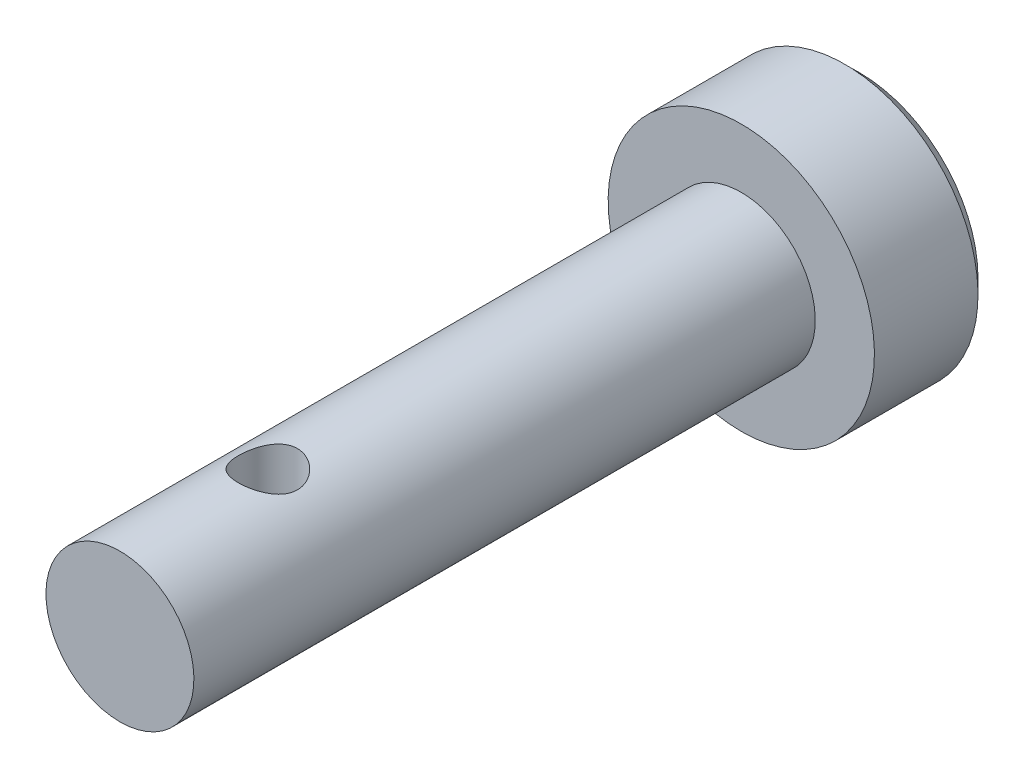
ISO-10303-21;
HEADER;
FILE_DESCRIPTION(('STEP AP214'),'2;1');
FILE_NAME('part.step','',(''),(''),'','','');
FILE_SCHEMA(('AUTOMOTIVE_DESIGN { 1 0 10303 214 1 1 1 1 }'));
ENDSEC;
DATA;
#1=APPLICATION_CONTEXT('core data for automotive mechanical design processes');
#2=APPLICATION_PROTOCOL_DEFINITION('international standard','automotive_design',2000,#1);
#3=PRODUCT_CONTEXT('',#1,'mechanical');
#4=PRODUCT('Part','Part','',(#3));
#5=PRODUCT_RELATED_PRODUCT_CATEGORY('part','',(#4));
#6=PRODUCT_DEFINITION_FORMATION('','',#4);
#7=PRODUCT_DEFINITION_CONTEXT('part definition',#1,'design');
#8=PRODUCT_DEFINITION('design','',#6,#7);
#9=PRODUCT_DEFINITION_SHAPE('','',#8);
#10=(LENGTH_UNIT() NAMED_UNIT(*) SI_UNIT(.MILLI.,.METRE.));
#11=(NAMED_UNIT(*) PLANE_ANGLE_UNIT() SI_UNIT($,.RADIAN.));
#12=(NAMED_UNIT(*) SI_UNIT($,.STERADIAN.) SOLID_ANGLE_UNIT());
#13=UNCERTAINTY_MEASURE_WITH_UNIT(LENGTH_MEASURE(1.E-05),#10,'distance_accuracy_value','');
#14=(GEOMETRIC_REPRESENTATION_CONTEXT(3) GLOBAL_UNCERTAINTY_ASSIGNED_CONTEXT((#13)) GLOBAL_UNIT_ASSIGNED_CONTEXT((#10,
#11,#12)) REPRESENTATION_CONTEXT('',''));
#15=CARTESIAN_POINT('',(0.,0.,0.));
#16=DIRECTION('',(0.,0.,1.));
#17=DIRECTION('',(1.,0.,0.));
#18=AXIS2_PLACEMENT_3D('',#15,#16,#17);
#19=CARTESIAN_POINT('',(0.,0.,0.));
#20=DIRECTION('',(0.,0.,1.));
#21=DIRECTION('',(0.,-1.,0.));
#22=AXIS2_PLACEMENT_3D('',#19,#20,#21);
#23=PLANE('',#22);
#24=CARTESIAN_POINT('',(0.,0.,0.));
#25=DIRECTION('',(0.,0.,1.));
#26=DIRECTION('',(0.,-1.,0.));
#27=AXIS2_PLACEMENT_3D('',#24,#25,#26);
#28=CIRCLE('',#27,8.);
#29=CARTESIAN_POINT('',(0.,-8.,0.));
#30=VERTEX_POINT('',#29);
#31=EDGE_CURVE('E10',#30,#30,#28,.F.);
#32=ORIENTED_EDGE('',*,*,#31,.T.);
#33=EDGE_LOOP('',(#32));
#34=FACE_BOUND('',#33,.T.);
#35=ADVANCED_FACE('F39',(#34),#23,.F.);
#36=CARTESIAN_POINT('',(0.,0.,50.));
#37=DIRECTION('',(0.,0.,1.));
#38=DIRECTION('',(0.,-1.,0.));
#39=AXIS2_PLACEMENT_3D('',#36,#37,#38);
#40=CYLINDRICAL_SURFACE('',#39,9.);
#41=CARTESIAN_POINT('',(0.,0.,1.));
#42=DIRECTION('',(0.,0.,1.));
#43=DIRECTION('',(0.,-1.,0.));
#44=AXIS2_PLACEMENT_3D('',#41,#42,#43);
#45=CIRCLE('',#44,9.);
#46=CARTESIAN_POINT('',(0.,-9.,1.));
#47=VERTEX_POINT('',#46);
#48=EDGE_CURVE('E48',#47,#47,#45,.T.);
#49=ORIENTED_EDGE('',*,*,#48,.T.);
#50=EDGE_LOOP('',(#49));
#51=FACE_BOUND('',#50,.T.);
#52=CARTESIAN_POINT('',(0.,0.,8.));
#53=DIRECTION('',(0.,0.,1.));
#54=DIRECTION('',(0.,-1.,0.));
#55=AXIS2_PLACEMENT_3D('',#52,#53,#54);
#56=CIRCLE('',#55,9.);
#57=CARTESIAN_POINT('',(0.,-9.,8.));
#58=VERTEX_POINT('',#57);
#59=EDGE_CURVE('E58',#58,#58,#56,.T.);
#60=ORIENTED_EDGE('',*,*,#59,.F.);
#61=EDGE_LOOP('',(#60));
#62=FACE_BOUND('',#61,.T.);
#63=ADVANCED_FACE('F90',(#51,#62),#40,.T.);
#64=CARTESIAN_POINT('',(0.,9.,8.));
#65=DIRECTION('',(0.,0.,-1.));
#66=DIRECTION('',(0.,1.,0.));
#67=AXIS2_PLACEMENT_3D('',#64,#65,#66);
#68=PLANE('',#67);
#69=CARTESIAN_POINT('',(0.,0.,8.));
#70=DIRECTION('',(0.,0.,1.));
#71=DIRECTION('',(0.,-1.,0.));
#72=AXIS2_PLACEMENT_3D('',#69,#70,#71);
#73=CIRCLE('',#72,5.);
#74=CARTESIAN_POINT('',(0.,-5.,8.));
#75=VERTEX_POINT('',#74);
#76=EDGE_CURVE('E102',#75,#75,#73,.T.);
#77=ORIENTED_EDGE('',*,*,#76,.F.);
#78=EDGE_LOOP('',(#77));
#79=FACE_BOUND('',#78,.T.);
#80=ORIENTED_EDGE('',*,*,#59,.T.);
#81=EDGE_LOOP('',(#80));
#82=FACE_BOUND('',#81,.T.);
#83=ADVANCED_FACE('F86',(#79,#82),#68,.F.);
#84=CARTESIAN_POINT('',(0.,0.,50.));
#85=DIRECTION('',(0.,0.,1.));
#86=DIRECTION('',(0.,-1.,0.));
#87=AXIS2_PLACEMENT_3D('',#84,#85,#86);
#88=CYLINDRICAL_SURFACE('',#87,5.);
#89=CARTESIAN_POINT('',(0.,5.,42.));
#90=CARTESIAN_POINT('',(-0.107493005442891,4.99999271227085,41.9999901481763));
#91=CARTESIAN_POINT('',(-0.215172564090672,4.99649294306932,41.9912822479116));
#92=CARTESIAN_POINT('',(-0.427496480417894,4.98283453100641,41.9567522964788));
#93=CARTESIAN_POINT('',(-0.532131777561246,4.97265778698877,41.9308837209139));
#94=CARTESIAN_POINT('',(-0.734953922727401,4.94674209213118,41.8631239219412));
#95=CARTESIAN_POINT('',(-0.833160661616958,4.93102136364072,41.8212851537833));
#96=CARTESIAN_POINT('',(-1.02107197032837,4.89556610796078,41.7229808266734));
#97=CARTESIAN_POINT('',(-1.11077947675099,4.87583297458057,41.6665203450811));
#98=CARTESIAN_POINT('',(-1.28350100757039,4.83330886170419,41.5377645014391));
#99=CARTESIAN_POINT('',(-1.36606227255021,4.8104229692919,41.4648933437597));
#100=CARTESIAN_POINT('',(-1.51817500478472,4.76460576906194,41.3065999965232));
#101=CARTESIAN_POINT('',(-1.58772010713353,4.74167444453792,41.2211717027883));
#102=CARTESIAN_POINT('',(-1.71487456729287,4.69722791797136,41.0355719297577));
#103=CARTESIAN_POINT('',(-1.77181498119547,4.67582115964951,40.9349135139768));
#104=CARTESIAN_POINT('',(-1.86775471903714,4.63833647186792,40.7244636015799));
#105=CARTESIAN_POINT('',(-1.90676256428583,4.62225601244176,40.6146764721516));
#106=CARTESIAN_POINT('',(-1.96389882339586,4.59826357660818,40.3942876664079));
#107=CARTESIAN_POINT('',(-1.98289396580564,4.59001420355605,40.2839487644238));
#108=CARTESIAN_POINT('',(-2.00217296164002,4.58164004049144,40.0613650016927));
#109=CARTESIAN_POINT('',(-2.00246601631321,4.58151125522768,39.949121105375));
#110=CARTESIAN_POINT('',(-1.98498936750454,4.58910500279994,39.734243328542));
#111=CARTESIAN_POINT('',(-1.96847531430513,4.5962817503845,39.631484285591));
#112=CARTESIAN_POINT('',(-1.91994688029781,4.61676187607836,39.4303404439933));
#113=CARTESIAN_POINT('',(-1.88792979480462,4.63006632321673,39.3319564118897));
#114=CARTESIAN_POINT('',(-1.80869473255106,4.6615948508853,39.139982163804));
#115=CARTESIAN_POINT('',(-1.76117986231531,4.67991379280788,39.0465307609453));
#116=CARTESIAN_POINT('',(-1.6525064607322,4.7193811638989,38.8685841836384));
#117=CARTESIAN_POINT('',(-1.59134280510084,4.74053065456848,38.7840923905972));
#118=CARTESIAN_POINT('',(-1.45155059945443,4.78526736742271,38.619590271198));
#119=CARTESIAN_POINT('',(-1.37193746297063,4.80891664976151,38.540431270554));
#120=CARTESIAN_POINT('',(-1.20031442743019,4.85459824958282,38.396315521998));
#121=CARTESIAN_POINT('',(-1.10830206533443,4.87663024445325,38.3313616025897));
#122=CARTESIAN_POINT('',(-0.912077652605836,4.91714681264548,38.2163825525842));
#123=CARTESIAN_POINT('',(-0.80766049134647,4.93555270095415,38.166677718803));
#124=CARTESIAN_POINT('',(-0.591023765482874,4.96614828328759,38.085832138922));
#125=CARTESIAN_POINT('',(-0.478808196849666,4.97834113462382,38.0546819624426));
#126=CARTESIAN_POINT('',(-0.256895887607813,4.9945613950691,38.0135517045803));
#127=CARTESIAN_POINT('',(-0.147443293985528,4.99902945833514,38.0024275457464));
#128=CARTESIAN_POINT('',(0.0718453098078221,5.00068478510631,37.9982868994714));
#129=CARTESIAN_POINT('',(0.181681213223928,4.99787393582291,38.0052657184525));
#130=CARTESIAN_POINT('',(0.393432739121991,4.98557567063753,38.036291752552));
#131=CARTESIAN_POINT('',(0.495482491775479,4.97639391345523,38.059557980351));
#132=CARTESIAN_POINT('',(0.694135428060783,4.952594414055,38.1214357083098));
#133=CARTESIAN_POINT('',(0.790737910224846,4.9379759735653,38.1600491796687));
#134=CARTESIAN_POINT('',(0.979078785816701,4.90416594770811,38.25278493968));
#135=CARTESIAN_POINT('',(1.0705780227554,4.88484815979803,38.3073454720432));
#136=CARTESIAN_POINT('',(1.24344359124655,4.84373364745525,38.4299403239057));
#137=CARTESIAN_POINT('',(1.32480584076112,4.8219359311027,38.4979800429226));
#138=CARTESIAN_POINT('',(1.48072304302882,4.77645117638112,38.6508700129496));
#139=CARTESIAN_POINT('',(1.55447393380606,4.75273441425052,38.7365335415062));
#140=CARTESIAN_POINT('',(1.68675119741371,4.70741672917132,38.9194400830094));
#141=CARTESIAN_POINT('',(1.74527506133751,4.68581615526511,39.01668500034));
#142=CARTESIAN_POINT('',(1.84580750193162,4.64714299907708,39.2214616945941));
#143=CARTESIAN_POINT('',(1.88765059453445,4.63011630884788,39.3290839992123));
#144=CARTESIAN_POINT('',(1.9522962197053,4.60323673477931,39.5507336517152));
#145=CARTESIAN_POINT('',(1.97511280526931,4.59337855695998,39.6647562058124));
#146=CARTESIAN_POINT('',(1.99971561727839,4.58271759299926,39.8871279017746));
#147=CARTESIAN_POINT('',(2.00289708230286,4.58131421008172,39.9952948395934));
#148=CARTESIAN_POINT('',(1.99180315927752,4.58614836033098,40.2105448577133));
#149=CARTESIAN_POINT('',(1.97752998791377,4.59238492324794,40.3176280739026));
#150=CARTESIAN_POINT('',(1.93307136615364,4.61126649079021,40.523332189855));
#151=CARTESIAN_POINT('',(1.90353749357097,4.6236483182745,40.622120274433));
#152=CARTESIAN_POINT('',(1.830005448491,4.65324001232697,40.8133786296135));
#153=CARTESIAN_POINT('',(1.7860032813938,4.67045121206007,40.9058471468998));
#154=CARTESIAN_POINT('',(1.68187276275972,4.70898609604492,41.0876096192708));
#155=CARTESIAN_POINT('',(1.62096533515948,4.73048882313242,41.1764186701305));
#156=CARTESIAN_POINT('',(1.48589211927148,4.77463804372237,41.3429933172038));
#157=CARTESIAN_POINT('',(1.41172233481811,4.79728488048407,41.4207555721283));
#158=CARTESIAN_POINT('',(1.24650550627245,4.84293567087394,41.5682028532636));
#159=CARTESIAN_POINT('',(1.15467600114613,4.86586757962185,41.6370373068981));
#160=CARTESIAN_POINT('',(0.959900320285769,4.90800406713717,41.7583370426216));
#161=CARTESIAN_POINT('',(0.856949004547229,4.92720691092906,41.8107947121525));
#162=CARTESIAN_POINT('',(0.644738062495197,4.95939714815861,41.8966222151903));
#163=CARTESIAN_POINT('',(0.535631618219691,4.97249363055028,41.9303293235603));
#164=CARTESIAN_POINT('',(0.312876546281216,4.99144306209365,41.9786391209543));
#165=CARTESIAN_POINT('',(0.199243525858906,4.99731899495637,41.9933024367439));
#166=CARTESIAN_POINT('',(0.056912297890925,4.99975899504136,41.9993953809783));
#167=CARTESIAN_POINT('',(0.0284626887407561,5.00000192969176,42.0000026086292));
#168=CARTESIAN_POINT('',(0.,5.,42.));
#169=B_SPLINE_CURVE_WITH_KNOTS('',3,(#89,#90,#91,#92,#93,#94,#95,#96,#97,#98,#99,#100,#101,#102,
#103,#104,#105,#106,#107,#108,#109,#110,#111,#112,#113,#114,#115,#116,#117,#118,#119,#120,#121,
#122,#123,#124,#125,#126,#127,#128,#129,#130,#131,#132,#133,#134,#135,#136,#137,#138,#139,#140,
#141,#142,#143,#144,#145,#146,#147,#148,#149,#150,#151,#152,#153,#154,#155,#156,#157,#158,#159,
#160,#161,#162,#163,#164,#165,#166,#167,#168),.UNSPECIFIED.,.T.,.F.,(4,2,2,2,2,2,2,2,2,2,2,2,2,
2,2,2,2,2,2,2,2,2,2,2,2,2,2,2,2,2,2,2,2,2,2,2,2,2,2,4),(0.,0.32240298789307,0.645683636007934,
0.967911457471581,1.29002753567984,1.62597381700396,1.96208394934411,2.31315258819217,
2.66405423118267,2.99904105308827,3.33386306340487,3.64538328401371,3.95695787256046,
4.27489126298815,4.59294421938181,4.93558349186555,5.27829092839731,5.62776913162804,
5.97706956113788,6.30569184528005,6.6342289357008,6.94800455564363,7.26182048993794,
7.58523513398259,7.90877959498966,8.2536847462441,8.59864669043745,8.94695045140825,
9.2949967264593,9.61799673392745,9.94095572563042,10.2511431854877,10.5614163580516,
10.8894546805669,11.2175920134839,11.5670042353383,11.9165786364053,12.2596430101331,
12.6016125240434,12.6869804589679),.UNSPECIFIED.);
#170=CARTESIAN_POINT('',(0.,5.,42.));
#171=VERTEX_POINT('',#170);
#172=EDGE_CURVE('E53',#171,#171,#169,.T.);
#173=ORIENTED_EDGE('',*,*,#172,.T.);
#174=EDGE_LOOP('',(#173));
#175=FACE_BOUND('',#174,.T.);
#176=CARTESIAN_POINT('',(0.,-5.,38.));
#177=CARTESIAN_POINT('',(-0.107493005442891,-4.99999271227084,38.0000098518237));
#178=CARTESIAN_POINT('',(-0.215172564090673,-4.99649294306932,38.0087177520884));
#179=CARTESIAN_POINT('',(-0.427496480417895,-4.98283453100641,38.0432477035212));
#180=CARTESIAN_POINT('',(-0.532131777561246,-4.97265778698877,38.0691162790861));
#181=CARTESIAN_POINT('',(-0.7349539227274,-4.94674209213118,38.1368760780588));
#182=CARTESIAN_POINT('',(-0.833160661616955,-4.93102136364072,38.1787148462167));
#183=CARTESIAN_POINT('',(-1.02107197032836,-4.89556610796078,38.2770191733266));
#184=CARTESIAN_POINT('',(-1.11077947675099,-4.87583297458057,38.3334796549189));
#185=CARTESIAN_POINT('',(-1.28350100757039,-4.83330886170419,38.4622354985609));
#186=CARTESIAN_POINT('',(-1.36606227255021,-4.8104229692919,38.5351066562403));
#187=CARTESIAN_POINT('',(-1.51817500478472,-4.76460576906194,38.6934000034768));
#188=CARTESIAN_POINT('',(-1.58772010713353,-4.74167444453792,38.7788282972118));
#189=CARTESIAN_POINT('',(-1.71487456729287,-4.69722791797136,38.9644280702423));
#190=CARTESIAN_POINT('',(-1.77181498119547,-4.67582115964951,39.0650864860232));
#191=CARTESIAN_POINT('',(-1.86775471903714,-4.63833647186792,39.2755363984201));
#192=CARTESIAN_POINT('',(-1.90676256428583,-4.62225601244176,39.3853235278484));
#193=CARTESIAN_POINT('',(-1.96389882339586,-4.59826357660818,39.6057123335921));
#194=CARTESIAN_POINT('',(-1.98289396580564,-4.59001420355605,39.7160512355762));
#195=CARTESIAN_POINT('',(-2.00217296164002,-4.58164004049144,39.9386349983073));
#196=CARTESIAN_POINT('',(-2.00246601631321,-4.58151125522768,40.050878894625));
#197=CARTESIAN_POINT('',(-1.98498936750454,-4.58910500279994,40.265756671458));
#198=CARTESIAN_POINT('',(-1.96847531430513,-4.5962817503845,40.368515714409));
#199=CARTESIAN_POINT('',(-1.91994688029781,-4.61676187607836,40.5696595560067));
#200=CARTESIAN_POINT('',(-1.88792979480462,-4.63006632321673,40.6680435881103));
#201=CARTESIAN_POINT('',(-1.80869473255106,-4.6615948508853,40.860017836196));
#202=CARTESIAN_POINT('',(-1.76117986231531,-4.67991379280788,40.9534692390547));
#203=CARTESIAN_POINT('',(-1.6525064607322,-4.7193811638989,41.1314158163616));
#204=CARTESIAN_POINT('',(-1.59134280510084,-4.74053065456848,41.2159076094028));
#205=CARTESIAN_POINT('',(-1.45155059945443,-4.78526736742271,41.380409728802));
#206=CARTESIAN_POINT('',(-1.37193746297063,-4.80891664976151,41.459568729446));
#207=CARTESIAN_POINT('',(-1.20031442743019,-4.85459824958282,41.603684478002));
#208=CARTESIAN_POINT('',(-1.10830206533443,-4.87663024445325,41.6686383974103));
#209=CARTESIAN_POINT('',(-0.912077652605836,-4.91714681264548,41.7836174474158));
#210=CARTESIAN_POINT('',(-0.80766049134647,-4.93555270095415,41.833322281197));
#211=CARTESIAN_POINT('',(-0.591023765482874,-4.96614828328759,41.914167861078));
#212=CARTESIAN_POINT('',(-0.478808196849666,-4.97834113462382,41.9453180375574));
#213=CARTESIAN_POINT('',(-0.256895887607813,-4.9945613950691,41.9864482954197));
#214=CARTESIAN_POINT('',(-0.147443293985528,-4.99902945833514,41.9975724542536));
#215=CARTESIAN_POINT('',(0.0718453098078221,-5.00068478510631,42.0017131005286));
#216=CARTESIAN_POINT('',(0.181681213223928,-4.99787393582291,41.9947342815475));
#217=CARTESIAN_POINT('',(0.393432739121991,-4.98557567063753,41.963708247448));
#218=CARTESIAN_POINT('',(0.495482491775479,-4.97639391345523,41.940442019649));
#219=CARTESIAN_POINT('',(0.694135428060783,-4.952594414055,41.8785642916902));
#220=CARTESIAN_POINT('',(0.790737910224846,-4.9379759735653,41.8399508203313));
#221=CARTESIAN_POINT('',(0.979078785816702,-4.90416594770811,41.74721506032));
#222=CARTESIAN_POINT('',(1.07057802275541,-4.88484815979803,41.6926545279568));
#223=CARTESIAN_POINT('',(1.24344359124655,-4.84373364745524,41.5700596760943));
#224=CARTESIAN_POINT('',(1.32480584076112,-4.8219359311027,41.5020199570774));
#225=CARTESIAN_POINT('',(1.48072304302882,-4.77645117638112,41.3491299870504));
#226=CARTESIAN_POINT('',(1.55447393380606,-4.75273441425052,41.2634664584938));
#227=CARTESIAN_POINT('',(1.68675119741371,-4.70741672917132,41.0805599169906));
#228=CARTESIAN_POINT('',(1.74527506133751,-4.68581615526511,40.98331499966));
#229=CARTESIAN_POINT('',(1.84580750193162,-4.64714299907708,40.7785383054059));
#230=CARTESIAN_POINT('',(1.88765059453445,-4.63011630884788,40.6709160007877));
#231=CARTESIAN_POINT('',(1.9522962197053,-4.60323673477931,40.4492663482848));
#232=CARTESIAN_POINT('',(1.97511280526931,-4.59337855695998,40.3352437941876));
#233=CARTESIAN_POINT('',(1.99971561727839,-4.58271759299926,40.1128720982255));
#234=CARTESIAN_POINT('',(2.00289708230286,-4.58131421008172,40.0047051604066));
#235=CARTESIAN_POINT('',(1.99180315927752,-4.58614836033098,39.7894551422867));
#236=CARTESIAN_POINT('',(1.97752998791377,-4.59238492324794,39.6823719260974));
#237=CARTESIAN_POINT('',(1.93307136615364,-4.61126649079021,39.476667810145));
#238=CARTESIAN_POINT('',(1.90353749357097,-4.6236483182745,39.377879725567));
#239=CARTESIAN_POINT('',(1.830005448491,-4.65324001232697,39.1866213703865));
#240=CARTESIAN_POINT('',(1.7860032813938,-4.67045121206007,39.0941528531002));
#241=CARTESIAN_POINT('',(1.68187276275972,-4.70898609604492,38.9123903807292));
#242=CARTESIAN_POINT('',(1.62096533515948,-4.73048882313242,38.8235813298695));
#243=CARTESIAN_POINT('',(1.48589211927148,-4.77463804372237,38.6570066827962));
#244=CARTESIAN_POINT('',(1.41172233481811,-4.79728488048407,38.5792444278717));
#245=CARTESIAN_POINT('',(1.24650550627245,-4.84293567087394,38.4317971467364));
#246=CARTESIAN_POINT('',(1.15467600114613,-4.86586757962185,38.3629626931019));
#247=CARTESIAN_POINT('',(0.959900320285769,-4.90800406713717,38.2416629573784));
#248=CARTESIAN_POINT('',(0.856949004547229,-4.92720691092906,38.1892052878475));
#249=CARTESIAN_POINT('',(0.644738062495197,-4.95939714815861,38.1033777848097));
#250=CARTESIAN_POINT('',(0.535631618219691,-4.97249363055028,38.0696706764397));
#251=CARTESIAN_POINT('',(0.312876546281215,-4.99144306209365,38.0213608790457));
#252=CARTESIAN_POINT('',(0.199243525858906,-4.99731899495637,38.0066975632561));
#253=CARTESIAN_POINT('',(0.056912297890925,-4.99975899504136,38.0006046190217));
#254=CARTESIAN_POINT('',(0.0284626887407561,-5.00000192969175,37.9999973913708));
#255=CARTESIAN_POINT('',(0.,-5.,38.));
#256=B_SPLINE_CURVE_WITH_KNOTS('',3,(#176,#177,#178,#179,#180,#181,#182,#183,#184,#185,#186,
#187,#188,#189,#190,#191,#192,#193,#194,#195,#196,#197,#198,#199,#200,#201,#202,#203,#204,#205,
#206,#207,#208,#209,#210,#211,#212,#213,#214,#215,#216,#217,#218,#219,#220,#221,#222,#223,#224,
#225,#226,#227,#228,#229,#230,#231,#232,#233,#234,#235,#236,#237,#238,#239,#240,#241,#242,#243,
#244,#245,#246,#247,#248,#249,#250,#251,#252,#253,#254,#255),.UNSPECIFIED.,.T.,.F.,(4,2,2,2,2,2,
2,2,2,2,2,2,2,2,2,2,2,2,2,2,2,2,2,2,2,2,2,2,2,2,2,2,2,2,2,2,2,2,2,4),(0.,0.32240298789307,
0.645683636007934,0.967911457471578,1.29002753567984,1.62597381700396,1.96208394934411,
2.31315258819217,2.66405423118267,2.99904105308827,3.33386306340487,3.64538328401371,
3.95695787256046,4.27489126298815,4.59294421938181,4.93558349186555,5.27829092839731,
5.62776913162804,5.97706956113788,6.30569184528005,6.6342289357008,6.94800455564363,
7.26182048993794,7.5852351339826,7.90877959498966,8.2536847462441,8.59864669043745,
8.94695045140825,9.2949967264593,9.61799673392745,9.94095572563043,10.2511431854877,
10.5614163580516,10.8894546805669,11.2175920134839,11.5670042353383,11.9165786364053,
12.2596430101331,12.6016125240434,12.6869804589679),.UNSPECIFIED.);
#257=CARTESIAN_POINT('',(0.,-5.,38.));
#258=VERTEX_POINT('',#257);
#259=EDGE_CURVE('E66',#258,#258,#256,.T.);
#260=ORIENTED_EDGE('',*,*,#259,.T.);
#261=EDGE_LOOP('',(#260));
#262=FACE_BOUND('',#261,.T.);
#263=CARTESIAN_POINT('',(0.,0.,50.));
#264=DIRECTION('',(0.,0.,1.));
#265=DIRECTION('',(0.,-1.,0.));
#266=AXIS2_PLACEMENT_3D('',#263,#264,#265);
#267=CIRCLE('',#266,4.99999999999999);
#268=CARTESIAN_POINT('',(0.,-4.99999999999999,50.));
#269=VERTEX_POINT('',#268);
#270=EDGE_CURVE('E108',#269,#269,#267,.T.);
#271=ORIENTED_EDGE('',*,*,#270,.F.);
#272=EDGE_LOOP('',(#271));
#273=FACE_BOUND('',#272,.T.);
#274=ORIENTED_EDGE('',*,*,#76,.T.);
#275=EDGE_LOOP('',(#274));
#276=FACE_BOUND('',#275,.T.);
#277=ADVANCED_FACE('F71',(#175,#262,#273,#276),#88,.T.);
#278=CARTESIAN_POINT('',(0.,4.99999999999999,50.));
#279=DIRECTION('',(0.,0.,-1.));
#280=DIRECTION('',(0.,1.,0.));
#281=AXIS2_PLACEMENT_3D('',#278,#279,#280);
#282=PLANE('',#281);
#283=ORIENTED_EDGE('',*,*,#270,.T.);
#284=EDGE_LOOP('',(#283));
#285=FACE_BOUND('',#284,.T.);
#286=ADVANCED_FACE('F78',(#285),#282,.F.);
#287=CARTESIAN_POINT('',(0.,5.,40.));
#288=DIRECTION('',(0.,1.,0.));
#289=DIRECTION('',(0.,0.,1.));
#290=AXIS2_PLACEMENT_3D('',#287,#288,#289);
#291=CYLINDRICAL_SURFACE('',#290,1.99999999999999);
#292=ORIENTED_EDGE('',*,*,#259,.F.);
#293=EDGE_LOOP('',(#292));
#294=FACE_BOUND('',#293,.T.);
#295=ORIENTED_EDGE('',*,*,#172,.F.);
#296=EDGE_LOOP('',(#295));
#297=FACE_BOUND('',#296,.T.);
#298=ADVANCED_FACE('F75',(#294,#297),#291,.F.);
#299=CARTESIAN_POINT('',(0.,0.,1.));
#300=DIRECTION('',(0.,0.,1.));
#301=DIRECTION('',(0.,-1.,0.));
#302=AXIS2_PLACEMENT_3D('',#299,#300,#301);
#303=CONICAL_SURFACE('',#302,9.,0.785398163397447);
#304=ORIENTED_EDGE('',*,*,#31,.F.);
#305=EDGE_LOOP('',(#304));
#306=FACE_BOUND('',#305,.T.);
#307=ORIENTED_EDGE('',*,*,#48,.F.);
#308=EDGE_LOOP('',(#307));
#309=FACE_BOUND('',#308,.T.);
#310=ADVANCED_FACE('F42',(#306,#309),#303,.T.);
#311=CLOSED_SHELL('',(#35,#63,#83,#277,#286,#298,#310));
#312=MANIFOLD_SOLID_BREP('B2',#311);
#313=ADVANCED_BREP_SHAPE_REPRESENTATION('',(#18,#312),#14);
#314=SHAPE_DEFINITION_REPRESENTATION(#9,#313);
ENDSEC;
END-ISO-10303-21;
